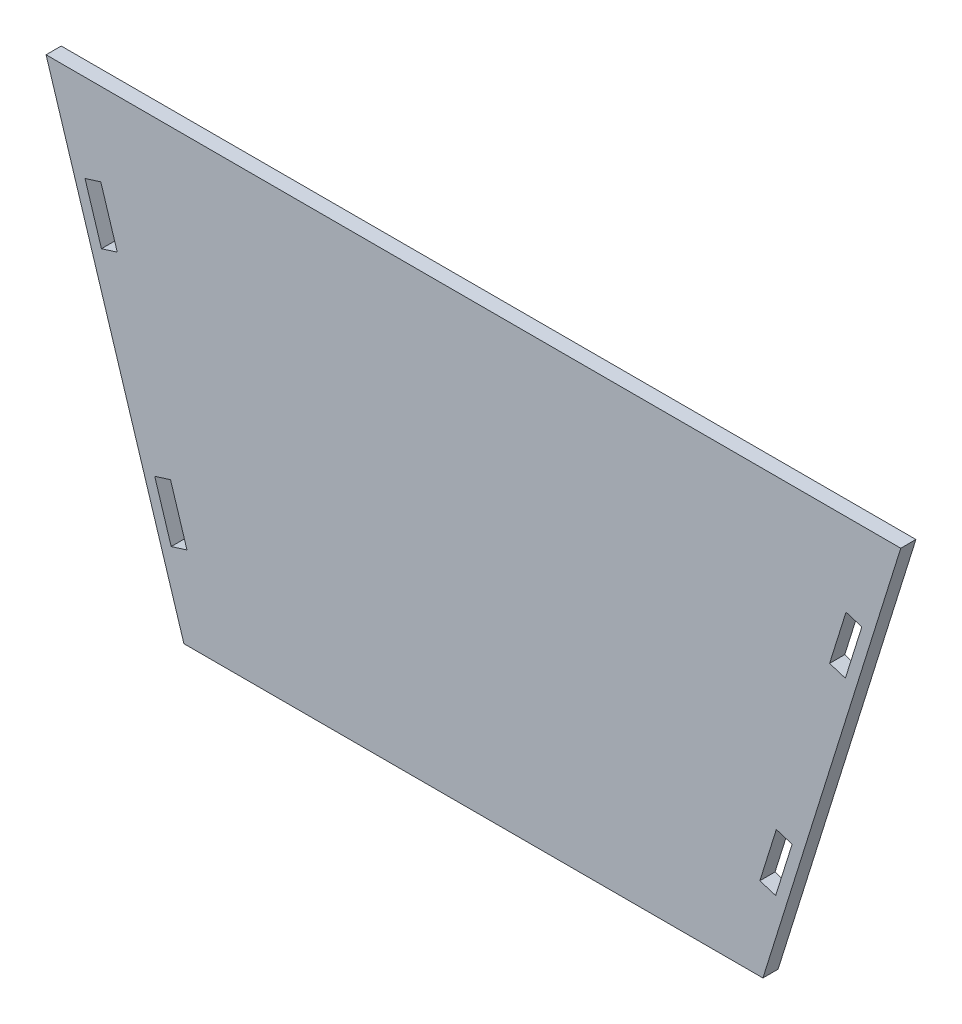
ISO-10303-21;
HEADER;
FILE_DESCRIPTION(('STEP AP214'),'2;1');
FILE_NAME('part.step','',(''),(''),'','','');
FILE_SCHEMA(('AUTOMOTIVE_DESIGN { 1 0 10303 214 1 1 1 1 }'));
ENDSEC;
DATA;
#1=APPLICATION_CONTEXT('core data for automotive mechanical design processes');
#2=APPLICATION_PROTOCOL_DEFINITION('international standard','automotive_design',2000,#1);
#3=PRODUCT_CONTEXT('',#1,'mechanical');
#4=PRODUCT('Part','Part','',(#3));
#5=PRODUCT_RELATED_PRODUCT_CATEGORY('part','',(#4));
#6=PRODUCT_DEFINITION_FORMATION('','',#4);
#7=PRODUCT_DEFINITION_CONTEXT('part definition',#1,'design');
#8=PRODUCT_DEFINITION('design','',#6,#7);
#9=PRODUCT_DEFINITION_SHAPE('','',#8);
#10=(LENGTH_UNIT() NAMED_UNIT(*) SI_UNIT(.MILLI.,.METRE.));
#11=(NAMED_UNIT(*) PLANE_ANGLE_UNIT() SI_UNIT($,.RADIAN.));
#12=(NAMED_UNIT(*) SI_UNIT($,.STERADIAN.) SOLID_ANGLE_UNIT());
#13=UNCERTAINTY_MEASURE_WITH_UNIT(LENGTH_MEASURE(1.E-05),#10,'distance_accuracy_value','');
#14=(GEOMETRIC_REPRESENTATION_CONTEXT(3) GLOBAL_UNCERTAINTY_ASSIGNED_CONTEXT((#13)) GLOBAL_UNIT_ASSIGNED_CONTEXT((#10,
#11,#12)) REPRESENTATION_CONTEXT('',''));
#15=CARTESIAN_POINT('',(0.,0.,0.));
#16=DIRECTION('',(0.,0.,1.));
#17=DIRECTION('',(1.,0.,0.));
#18=AXIS2_PLACEMENT_3D('',#15,#16,#17);
#19=CARTESIAN_POINT('',(52.5,0.,2.75));
#20=DIRECTION('',(-0.95447997803503,0.298274993135947,0.));
#21=DIRECTION('',(-0.298274993135947,-0.95447997803503,0.));
#22=AXIS2_PLACEMENT_3D('',#19,#20,#21);
#23=PLANE('',#22);
#24=DIRECTION('',(0.298274993135947,0.95447997803503,0.));
#25=VECTOR('',#24,1.);
#26=CARTESIAN_POINT('',(52.5,0.,0.));
#27=LINE('',#26,#25);
#28=CARTESIAN_POINT('',(52.5,0.,0.));
#29=VERTEX_POINT('',#28);
#30=CARTESIAN_POINT('',(77.5,80.,0.));
#31=VERTEX_POINT('',#30);
#32=EDGE_CURVE('E212',#29,#31,#27,.T.);
#33=ORIENTED_EDGE('',*,*,#32,.T.);
#34=DIRECTION('',(0.,0.,-1.));
#35=VECTOR('',#34,1.);
#36=CARTESIAN_POINT('',(77.5,80.,2.75));
#37=LINE('',#36,#35);
#38=CARTESIAN_POINT('',(77.5,80.,2.75));
#39=VERTEX_POINT('',#38);
#40=EDGE_CURVE('E336',#39,#31,#37,.T.);
#41=ORIENTED_EDGE('',*,*,#40,.F.);
#42=DIRECTION('',(0.298274993135947,0.95447997803503,0.));
#43=VECTOR('',#42,1.);
#44=CARTESIAN_POINT('',(52.5,0.,2.75));
#45=LINE('',#44,#43);
#46=CARTESIAN_POINT('',(52.5,0.,2.75));
#47=VERTEX_POINT('',#46);
#48=EDGE_CURVE('E299',#47,#39,#45,.T.);
#49=ORIENTED_EDGE('',*,*,#48,.F.);
#50=DIRECTION('',(0.,0.,-1.));
#51=VECTOR('',#50,1.);
#52=CARTESIAN_POINT('',(52.5,0.,2.75));
#53=LINE('',#52,#51);
#54=EDGE_CURVE('E313',#47,#29,#53,.T.);
#55=ORIENTED_EDGE('',*,*,#54,.T.);
#56=EDGE_LOOP('',(#33,#41,#49,#55));
#57=FACE_BOUND('',#56,.T.);
#58=ADVANCED_FACE('F39',(#57),#23,.F.);
#59=CARTESIAN_POINT('',(77.5,80.,2.75));
#60=DIRECTION('',(0.,-1.,0.));
#61=DIRECTION('',(0.,0.,-1.));
#62=AXIS2_PLACEMENT_3D('',#59,#60,#61);
#63=PLANE('',#62);
#64=DIRECTION('',(-1.,0.,0.));
#65=VECTOR('',#64,1.);
#66=CARTESIAN_POINT('',(77.5,80.,0.));
#67=LINE('',#66,#65);
#68=CARTESIAN_POINT('',(-77.5,80.,0.));
#69=VERTEX_POINT('',#68);
#70=EDGE_CURVE('E317',#31,#69,#67,.T.);
#71=ORIENTED_EDGE('',*,*,#70,.T.);
#72=DIRECTION('',(0.,0.,-1.));
#73=VECTOR('',#72,1.);
#74=CARTESIAN_POINT('',(-77.5,80.,2.75));
#75=LINE('',#74,#73);
#76=CARTESIAN_POINT('',(-77.5,80.,2.75));
#77=VERTEX_POINT('',#76);
#78=EDGE_CURVE('E332',#77,#69,#75,.T.);
#79=ORIENTED_EDGE('',*,*,#78,.F.);
#80=DIRECTION('',(-1.,0.,0.));
#81=VECTOR('',#80,1.);
#82=CARTESIAN_POINT('',(77.5,80.,2.75));
#83=LINE('',#82,#81);
#84=EDGE_CURVE('E303',#39,#77,#83,.T.);
#85=ORIENTED_EDGE('',*,*,#84,.F.);
#86=ORIENTED_EDGE('',*,*,#40,.T.);
#87=EDGE_LOOP('',(#71,#79,#85,#86));
#88=FACE_BOUND('',#87,.T.);
#89=ADVANCED_FACE('F415',(#88),#63,.F.);
#90=CARTESIAN_POINT('',(-52.5,0.,2.75));
#91=DIRECTION('',(0.95447997803503,0.298274993135947,0.));
#92=DIRECTION('',(-0.298274993135947,0.95447997803503,0.));
#93=AXIS2_PLACEMENT_3D('',#90,#91,#92);
#94=PLANE('',#93);
#95=DIRECTION('',(0.298274993135947,-0.95447997803503,0.));
#96=VECTOR('',#95,1.);
#97=CARTESIAN_POINT('',(-52.5,0.,0.));
#98=LINE('',#97,#96);
#99=CARTESIAN_POINT('',(-52.5,0.,0.));
#100=VERTEX_POINT('',#99);
#101=EDGE_CURVE('E320',#69,#100,#98,.T.);
#102=ORIENTED_EDGE('',*,*,#101,.T.);
#103=DIRECTION('',(0.,0.,-1.));
#104=VECTOR('',#103,1.);
#105=CARTESIAN_POINT('',(-52.5,0.,2.75));
#106=LINE('',#105,#104);
#107=CARTESIAN_POINT('',(-52.5,0.,2.75));
#108=VERTEX_POINT('',#107);
#109=EDGE_CURVE('E328',#108,#100,#106,.T.);
#110=ORIENTED_EDGE('',*,*,#109,.F.);
#111=DIRECTION('',(0.298274993135947,-0.95447997803503,0.));
#112=VECTOR('',#111,1.);
#113=CARTESIAN_POINT('',(-52.5,0.,2.75));
#114=LINE('',#113,#112);
#115=EDGE_CURVE('E307',#77,#108,#114,.T.);
#116=ORIENTED_EDGE('',*,*,#115,.F.);
#117=ORIENTED_EDGE('',*,*,#78,.T.);
#118=EDGE_LOOP('',(#102,#110,#116,#117));
#119=FACE_BOUND('',#118,.T.);
#120=ADVANCED_FACE('F420',(#119),#94,.F.);
#121=CARTESIAN_POINT('',(-52.5,0.,2.75));
#122=DIRECTION('',(0.,1.,0.));
#123=DIRECTION('',(0.,0.,1.));
#124=AXIS2_PLACEMENT_3D('',#121,#122,#123);
#125=PLANE('',#124);
#126=DIRECTION('',(1.,0.,0.));
#127=VECTOR('',#126,1.);
#128=CARTESIAN_POINT('',(-52.5,0.,0.));
#129=LINE('',#128,#127);
#130=EDGE_CURVE('E304',#100,#29,#129,.T.);
#131=ORIENTED_EDGE('',*,*,#130,.T.);
#132=ORIENTED_EDGE('',*,*,#54,.F.);
#133=DIRECTION('',(1.,0.,0.));
#134=VECTOR('',#133,1.);
#135=CARTESIAN_POINT('',(-52.5,0.,2.75));
#136=LINE('',#135,#134);
#137=EDGE_CURVE('E310',#108,#47,#136,.T.);
#138=ORIENTED_EDGE('',*,*,#137,.F.);
#139=ORIENTED_EDGE('',*,*,#109,.T.);
#140=EDGE_LOOP('',(#131,#132,#138,#139));
#141=FACE_BOUND('',#140,.T.);
#142=ADVANCED_FACE('F435',(#141),#125,.F.);
#143=CARTESIAN_POINT('',(0.,0.,2.75));
#144=DIRECTION('',(0.,0.,1.));
#145=DIRECTION('',(1.,0.,0.));
#146=AXIS2_PLACEMENT_3D('',#143,#144,#145);
#147=PLANE('',#146);
#148=DIRECTION('',(-0.95447997803503,0.298274993135945,0.));
#149=VECTOR('',#148,1.);
#150=CARTESIAN_POINT('',(70.437485367155,64.1051750205922,2.75));
#151=LINE('',#150,#149);
#152=CARTESIAN_POINT('',(70.437485367155,64.1051750205922,2.75));
#153=VERTEX_POINT('',#152);
#154=CARTESIAN_POINT('',(67.5740454330499,65.,2.75));
#155=VERTEX_POINT('',#154);
#156=EDGE_CURVE('E54',#153,#155,#151,.T.);
#157=ORIENTED_EDGE('',*,*,#156,.F.);
#158=DIRECTION('',(0.298274993135946,0.95447997803503,0.));
#159=VECTOR('',#158,1.);
#160=CARTESIAN_POINT('',(70.437485367155,64.1051750205922,2.75));
#161=LINE('',#160,#159);
#162=CARTESIAN_POINT('',(67.4547354357955,54.5603752402418,2.75));
#163=VERTEX_POINT('',#162);
#164=EDGE_CURVE('E202',#163,#153,#161,.T.);
#165=ORIENTED_EDGE('',*,*,#164,.F.);
#166=DIRECTION('',(0.954479978035028,-0.298274993135952,0.));
#167=VECTOR('',#166,1.);
#168=CARTESIAN_POINT('',(67.4547354357955,54.5603752402418,2.75));
#169=LINE('',#168,#167);
#170=CARTESIAN_POINT('',(64.5912955016905,55.4552002196497,2.75));
#171=VERTEX_POINT('',#170);
#172=EDGE_CURVE('E183',#171,#163,#169,.T.);
#173=ORIENTED_EDGE('',*,*,#172,.F.);
#174=DIRECTION('',(-0.298274993135944,-0.954479978035031,0.));
#175=VECTOR('',#174,1.);
#176=CARTESIAN_POINT('',(67.5740454330499,65.,2.75));
#177=LINE('',#176,#175);
#178=EDGE_CURVE('E194',#155,#171,#177,.T.);
#179=ORIENTED_EDGE('',*,*,#178,.F.);
#180=EDGE_LOOP('',(#157,#165,#173,#179));
#181=FACE_BOUND('',#180,.T.);
#182=DIRECTION('',(-0.954479978035029,0.298274993135949,0.));
#183=VECTOR('',#182,1.);
#184=CARTESIAN_POINT('',(57.7952352985145,23.6499748009425,2.75));
#185=LINE('',#184,#183);
#186=CARTESIAN_POINT('',(57.7952352985145,23.6499748009425,2.75));
#187=VERTEX_POINT('',#186);
#188=CARTESIAN_POINT('',(54.9317953644094,24.5447997803503,2.75));
#189=VERTEX_POINT('',#188);
#190=EDGE_CURVE('E62',#187,#189,#185,.T.);
#191=ORIENTED_EDGE('',*,*,#190,.F.);
#192=DIRECTION('',(0.298274993135947,0.95447997803503,0.));
#193=VECTOR('',#192,1.);
#194=CARTESIAN_POINT('',(57.7952352985145,23.6499748009425,2.75));
#195=LINE('',#194,#193);
#196=CARTESIAN_POINT('',(54.812485367155,14.1051750205922,2.75));
#197=VERTEX_POINT('',#196);
#198=EDGE_CURVE('E228',#197,#187,#195,.T.);
#199=ORIENTED_EDGE('',*,*,#198,.F.);
#200=DIRECTION('',(0.954479978035029,-0.298274993135947,0.));
#201=VECTOR('',#200,1.);
#202=CARTESIAN_POINT('',(54.812485367155,14.1051750205922,2.75));
#203=LINE('',#202,#201);
#204=CARTESIAN_POINT('',(51.9490454330499,15.,2.75));
#205=VERTEX_POINT('',#204);
#206=EDGE_CURVE('E224',#205,#197,#203,.T.);
#207=ORIENTED_EDGE('',*,*,#206,.F.);
#208=DIRECTION('',(-0.298274993135948,-0.954479978035029,0.));
#209=VECTOR('',#208,1.);
#210=CARTESIAN_POINT('',(54.9317953644094,24.5447997803503,2.75));
#211=LINE('',#210,#209);
#212=EDGE_CURVE('E219',#189,#205,#211,.T.);
#213=ORIENTED_EDGE('',*,*,#212,.F.);
#214=EDGE_LOOP('',(#191,#199,#207,#213));
#215=FACE_BOUND('',#214,.T.);
#216=DIRECTION('',(-0.954479978035029,-0.298274993135949,0.));
#217=VECTOR('',#216,1.);
#218=CARTESIAN_POINT('',(-57.7952352985145,23.6499748009425,2.75));
#219=LINE('',#218,#217);
#220=CARTESIAN_POINT('',(-54.9317953644094,24.5447997803503,2.75));
#221=VERTEX_POINT('',#220);
#222=CARTESIAN_POINT('',(-57.7952352985145,23.6499748009425,2.75));
#223=VERTEX_POINT('',#222);
#224=EDGE_CURVE('E244',#221,#223,#219,.T.);
#225=ORIENTED_EDGE('',*,*,#224,.F.);
#226=DIRECTION('',(-0.298274993135948,0.954479978035029,0.));
#227=VECTOR('',#226,1.);
#228=CARTESIAN_POINT('',(-54.9317953644094,24.5447997803503,2.75));
#229=LINE('',#228,#227);
#230=CARTESIAN_POINT('',(-51.9490454330499,15.,2.75));
#231=VERTEX_POINT('',#230);
#232=EDGE_CURVE('E256',#231,#221,#229,.T.);
#233=ORIENTED_EDGE('',*,*,#232,.F.);
#234=DIRECTION('',(0.954479978035029,0.298274993135947,0.));
#235=VECTOR('',#234,1.);
#236=CARTESIAN_POINT('',(-54.812485367155,14.1051750205922,2.75));
#237=LINE('',#236,#235);
#238=CARTESIAN_POINT('',(-54.812485367155,14.1051750205922,2.75));
#239=VERTEX_POINT('',#238);
#240=EDGE_CURVE('E252',#239,#231,#237,.T.);
#241=ORIENTED_EDGE('',*,*,#240,.F.);
#242=DIRECTION('',(0.298274993135947,-0.95447997803503,0.));
#243=VECTOR('',#242,1.);
#244=CARTESIAN_POINT('',(-57.7952352985145,23.6499748009425,2.75));
#245=LINE('',#244,#243);
#246=EDGE_CURVE('E247',#223,#239,#245,.T.);
#247=ORIENTED_EDGE('',*,*,#246,.F.);
#248=EDGE_LOOP('',(#225,#233,#241,#247));
#249=FACE_BOUND('',#248,.T.);
#250=DIRECTION('',(-0.95447997803503,-0.298274993135945,0.));
#251=VECTOR('',#250,1.);
#252=CARTESIAN_POINT('',(-70.437485367155,64.1051750205922,2.75));
#253=LINE('',#252,#251);
#254=CARTESIAN_POINT('',(-67.5740454330499,65.,2.75));
#255=VERTEX_POINT('',#254);
#256=CARTESIAN_POINT('',(-70.437485367155,64.1051750205922,2.75));
#257=VERTEX_POINT('',#256);
#258=EDGE_CURVE('E272',#255,#257,#253,.T.);
#259=ORIENTED_EDGE('',*,*,#258,.F.);
#260=DIRECTION('',(-0.298274993135946,0.95447997803503,0.));
#261=VECTOR('',#260,1.);
#262=CARTESIAN_POINT('',(-67.5740454330499,65.,2.75));
#263=LINE('',#262,#261);
#264=CARTESIAN_POINT('',(-64.5912955016904,55.4552002196497,2.75));
#265=VERTEX_POINT('',#264);
#266=EDGE_CURVE('E283',#265,#255,#263,.T.);
#267=ORIENTED_EDGE('',*,*,#266,.F.);
#268=DIRECTION('',(0.954479978035027,0.298274993135957,0.));
#269=VECTOR('',#268,1.);
#270=CARTESIAN_POINT('',(-67.4547354357955,54.5603752402418,2.75));
#271=LINE('',#270,#269);
#272=CARTESIAN_POINT('',(-67.4547354357955,54.5603752402418,2.75));
#273=VERTEX_POINT('',#272);
#274=EDGE_CURVE('E279',#273,#265,#271,.T.);
#275=ORIENTED_EDGE('',*,*,#274,.F.);
#276=DIRECTION('',(0.298274993135946,-0.95447997803503,0.));
#277=VECTOR('',#276,1.);
#278=CARTESIAN_POINT('',(-70.437485367155,64.1051750205922,2.75));
#279=LINE('',#278,#277);
#280=EDGE_CURVE('E275',#257,#273,#279,.T.);
#281=ORIENTED_EDGE('',*,*,#280,.F.);
#282=EDGE_LOOP('',(#259,#267,#275,#281));
#283=FACE_BOUND('',#282,.T.);
#284=ORIENTED_EDGE('',*,*,#48,.T.);
#285=ORIENTED_EDGE('',*,*,#84,.T.);
#286=ORIENTED_EDGE('',*,*,#115,.T.);
#287=ORIENTED_EDGE('',*,*,#137,.T.);
#288=EDGE_LOOP('',(#284,#285,#286,#287));
#289=FACE_BOUND('',#288,.T.);
#290=ADVANCED_FACE('F199',(#181,#215,#249,#283,#289),#147,.T.);
#291=CARTESIAN_POINT('',(0.,0.,0.));
#292=DIRECTION('',(0.,0.,1.));
#293=DIRECTION('',(1.,0.,0.));
#294=AXIS2_PLACEMENT_3D('',#291,#292,#293);
#295=PLANE('',#294);
#296=DIRECTION('',(0.298274993135946,0.95447997803503,0.));
#297=VECTOR('',#296,1.);
#298=CARTESIAN_POINT('',(45.9202215385919,-14.3500692308099,0.));
#299=LINE('',#298,#297);
#300=CARTESIAN_POINT('',(67.4547354357955,54.5603752402418,0.));
#301=VERTEX_POINT('',#300);
#302=CARTESIAN_POINT('',(70.437485367155,64.1051750205922,0.));
#303=VERTEX_POINT('',#302);
#304=EDGE_CURVE('E47',#301,#303,#299,.T.);
#305=ORIENTED_EDGE('',*,*,#304,.T.);
#306=DIRECTION('',(-0.95447997803503,0.298274993135945,0.));
#307=VECTOR('',#306,1.);
#308=CARTESIAN_POINT('',(24.517263828563,78.4552442514021,0.));
#309=LINE('',#308,#307);
#310=CARTESIAN_POINT('',(67.5740454330499,65.,0.));
#311=VERTEX_POINT('',#310);
#312=EDGE_CURVE('E11',#303,#311,#309,.T.);
#313=ORIENTED_EDGE('',*,*,#312,.T.);
#314=DIRECTION('',(-0.298274993135944,-0.954479978035031,0.));
#315=VECTOR('',#314,1.);
#316=CARTESIAN_POINT('',(43.056781604487,-13.455244251402,0.));
#317=LINE('',#316,#315);
#318=CARTESIAN_POINT('',(64.5912955016905,55.4552002196497,0.));
#319=VERTEX_POINT('',#318);
#320=EDGE_CURVE('E388',#311,#319,#317,.T.);
#321=ORIENTED_EDGE('',*,*,#320,.T.);
#322=DIRECTION('',(0.954479978035028,-0.298274993135952,0.));
#323=VECTOR('',#322,1.);
#324=CARTESIAN_POINT('',(21.5345138972041,68.9104444710519,0.));
#325=LINE('',#324,#323);
#326=EDGE_CURVE('E186',#319,#301,#325,.T.);
#327=ORIENTED_EDGE('',*,*,#326,.T.);
#328=EDGE_LOOP('',(#305,#313,#321,#327));
#329=FACE_BOUND('',#328,.T.);
#330=DIRECTION('',(0.298274993135947,0.95447997803503,0.));
#331=VECTOR('',#330,1.);
#332=CARTESIAN_POINT('',(45.9202215385919,-14.35006923081,0.));
#333=LINE('',#332,#331);
#334=CARTESIAN_POINT('',(54.812485367155,14.1051750205922,0.));
#335=VERTEX_POINT('',#334);
#336=CARTESIAN_POINT('',(57.7952352985145,23.6499748009425,0.));
#337=VERTEX_POINT('',#336);
#338=EDGE_CURVE('E380',#335,#337,#333,.T.);
#339=ORIENTED_EDGE('',*,*,#338,.T.);
#340=DIRECTION('',(-0.954479978035029,0.298274993135949,0.));
#341=VECTOR('',#340,1.);
#342=CARTESIAN_POINT('',(11.8750137599227,38.0000440317525,0.));
#343=LINE('',#342,#341);
#344=CARTESIAN_POINT('',(54.9317953644094,24.5447997803503,0.));
#345=VERTEX_POINT('',#344);
#346=EDGE_CURVE('E384',#337,#345,#343,.T.);
#347=ORIENTED_EDGE('',*,*,#346,.T.);
#348=DIRECTION('',(-0.298274993135948,-0.954479978035029,0.));
#349=VECTOR('',#348,1.);
#350=CARTESIAN_POINT('',(43.0567816044867,-13.4552442514022,0.));
#351=LINE('',#350,#349);
#352=CARTESIAN_POINT('',(51.9490454330499,15.,0.));
#353=VERTEX_POINT('',#352);
#354=EDGE_CURVE('E372',#345,#353,#351,.T.);
#355=ORIENTED_EDGE('',*,*,#354,.T.);
#356=DIRECTION('',(0.95447997803503,-0.298274993135948,0.));
#357=VECTOR('',#356,1.);
#358=CARTESIAN_POINT('',(8.89226382856319,28.4552442514021,0.));
#359=LINE('',#358,#357);
#360=EDGE_CURVE('E376',#353,#335,#359,.T.);
#361=ORIENTED_EDGE('',*,*,#360,.T.);
#362=EDGE_LOOP('',(#339,#347,#355,#361));
#363=FACE_BOUND('',#362,.T.);
#364=DIRECTION('',(-0.298274993135948,0.954479978035029,0.));
#365=VECTOR('',#364,1.);
#366=CARTESIAN_POINT('',(-43.0567816044867,-13.4552442514022,0.));
#367=LINE('',#366,#365);
#368=CARTESIAN_POINT('',(-51.9490454330499,15.,0.));
#369=VERTEX_POINT('',#368);
#370=CARTESIAN_POINT('',(-54.9317953644094,24.5447997803503,0.));
#371=VERTEX_POINT('',#370);
#372=EDGE_CURVE('E364',#369,#371,#367,.T.);
#373=ORIENTED_EDGE('',*,*,#372,.T.);
#374=DIRECTION('',(-0.954479978035029,-0.298274993135949,0.));
#375=VECTOR('',#374,1.);
#376=CARTESIAN_POINT('',(-11.8750137599227,38.0000440317525,0.));
#377=LINE('',#376,#375);
#378=CARTESIAN_POINT('',(-57.7952352985145,23.6499748009425,0.));
#379=VERTEX_POINT('',#378);
#380=EDGE_CURVE('E368',#371,#379,#377,.T.);
#381=ORIENTED_EDGE('',*,*,#380,.T.);
#382=DIRECTION('',(0.298274993135947,-0.95447997803503,0.));
#383=VECTOR('',#382,1.);
#384=CARTESIAN_POINT('',(-45.9202215385919,-14.35006923081,0.));
#385=LINE('',#384,#383);
#386=CARTESIAN_POINT('',(-54.812485367155,14.1051750205922,0.));
#387=VERTEX_POINT('',#386);
#388=EDGE_CURVE('E356',#379,#387,#385,.T.);
#389=ORIENTED_EDGE('',*,*,#388,.T.);
#390=DIRECTION('',(0.95447997803503,0.298274993135948,0.));
#391=VECTOR('',#390,1.);
#392=CARTESIAN_POINT('',(-8.89226382856319,28.4552442514021,0.));
#393=LINE('',#392,#391);
#394=EDGE_CURVE('E360',#387,#369,#393,.T.);
#395=ORIENTED_EDGE('',*,*,#394,.T.);
#396=EDGE_LOOP('',(#373,#381,#389,#395));
#397=FACE_BOUND('',#396,.T.);
#398=DIRECTION('',(-0.298274993135946,0.95447997803503,0.));
#399=VECTOR('',#398,1.);
#400=CARTESIAN_POINT('',(-43.0567816044869,-13.4552442514021,0.));
#401=LINE('',#400,#399);
#402=CARTESIAN_POINT('',(-64.5912955016904,55.4552002196497,0.));
#403=VERTEX_POINT('',#402);
#404=CARTESIAN_POINT('',(-67.5740454330499,65.,0.));
#405=VERTEX_POINT('',#404);
#406=EDGE_CURVE('E348',#403,#405,#401,.T.);
#407=ORIENTED_EDGE('',*,*,#406,.T.);
#408=DIRECTION('',(-0.95447997803503,-0.298274993135945,0.));
#409=VECTOR('',#408,1.);
#410=CARTESIAN_POINT('',(-24.517263828563,78.4552442514021,0.));
#411=LINE('',#410,#409);
#412=CARTESIAN_POINT('',(-70.437485367155,64.1051750205922,0.));
#413=VERTEX_POINT('',#412);
#414=EDGE_CURVE('E352',#405,#413,#411,.T.);
#415=ORIENTED_EDGE('',*,*,#414,.T.);
#416=DIRECTION('',(0.298274993135946,-0.95447997803503,0.));
#417=VECTOR('',#416,1.);
#418=CARTESIAN_POINT('',(-45.9202215385919,-14.3500692308099,0.));
#419=LINE('',#418,#417);
#420=CARTESIAN_POINT('',(-67.4547354357955,54.5603752402418,0.));
#421=VERTEX_POINT('',#420);
#422=EDGE_CURVE('E340',#413,#421,#419,.T.);
#423=ORIENTED_EDGE('',*,*,#422,.T.);
#424=DIRECTION('',(0.954479978035027,0.298274993135957,0.));
#425=VECTOR('',#424,1.);
#426=CARTESIAN_POINT('',(-21.5345138972045,68.910444471052,0.));
#427=LINE('',#426,#425);
#428=EDGE_CURVE('E344',#421,#403,#427,.T.);
#429=ORIENTED_EDGE('',*,*,#428,.T.);
#430=EDGE_LOOP('',(#407,#415,#423,#429));
#431=FACE_BOUND('',#430,.T.);
#432=ORIENTED_EDGE('',*,*,#32,.F.);
#433=ORIENTED_EDGE('',*,*,#130,.F.);
#434=ORIENTED_EDGE('',*,*,#101,.F.);
#435=ORIENTED_EDGE('',*,*,#70,.F.);
#436=EDGE_LOOP('',(#432,#433,#434,#435));
#437=FACE_BOUND('',#436,.T.);
#438=ADVANCED_FACE('F395',(#329,#363,#397,#431,#437),#295,.F.);
#439=CARTESIAN_POINT('',(-70.437485367155,64.1051750205922,-7.25));
#440=DIRECTION('',(-0.298274993135945,0.95447997803503,0.));
#441=DIRECTION('',(-0.95447997803503,-0.298274993135945,0.));
#442=AXIS2_PLACEMENT_3D('',#439,#440,#441);
#443=PLANE('',#442);
#444=DIRECTION('',(0.,0.,1.));
#445=VECTOR('',#444,1.);
#446=CARTESIAN_POINT('',(-67.5740454330499,65.,-7.25));
#447=LINE('',#446,#445);
#448=EDGE_CURVE('E248',#405,#255,#447,.T.);
#449=ORIENTED_EDGE('',*,*,#448,.T.);
#450=ORIENTED_EDGE('',*,*,#258,.T.);
#451=DIRECTION('',(0.,0.,1.));
#452=VECTOR('',#451,1.);
#453=CARTESIAN_POINT('',(-70.437485367155,64.1051750205922,-7.25));
#454=LINE('',#453,#452);
#455=EDGE_CURVE('E287',#413,#257,#454,.T.);
#456=ORIENTED_EDGE('',*,*,#455,.F.);
#457=ORIENTED_EDGE('',*,*,#414,.F.);
#458=EDGE_LOOP('',(#449,#450,#456,#457));
#459=FACE_BOUND('',#458,.T.);
#460=ADVANCED_FACE('F446',(#459),#443,.F.);
#461=CARTESIAN_POINT('',(-67.5740454330499,65.,-7.25));
#462=DIRECTION('',(0.95447997803503,0.298274993135946,0.));
#463=DIRECTION('',(-0.298274993135946,0.95447997803503,0.));
#464=AXIS2_PLACEMENT_3D('',#461,#462,#463);
#465=PLANE('',#464);
#466=DIRECTION('',(0.,0.,1.));
#467=VECTOR('',#466,1.);
#468=CARTESIAN_POINT('',(-64.5912955016904,55.4552002196497,-7.25));
#469=LINE('',#468,#467);
#470=EDGE_CURVE('E290',#403,#265,#469,.T.);
#471=ORIENTED_EDGE('',*,*,#470,.T.);
#472=ORIENTED_EDGE('',*,*,#266,.T.);
#473=ORIENTED_EDGE('',*,*,#448,.F.);
#474=ORIENTED_EDGE('',*,*,#406,.F.);
#475=EDGE_LOOP('',(#471,#472,#473,#474));
#476=FACE_BOUND('',#475,.T.);
#477=ADVANCED_FACE('F451',(#476),#465,.F.);
#478=CARTESIAN_POINT('',(-67.4547354357955,54.5603752402418,-7.25));
#479=DIRECTION('',(0.298274993135957,-0.954479978035027,0.));
#480=DIRECTION('',(0.954479978035027,0.298274993135957,0.));
#481=AXIS2_PLACEMENT_3D('',#478,#479,#480);
#482=PLANE('',#481);
#483=DIRECTION('',(0.,0.,1.));
#484=VECTOR('',#483,1.);
#485=CARTESIAN_POINT('',(-67.4547354357955,54.5603752402418,-7.25));
#486=LINE('',#485,#484);
#487=EDGE_CURVE('E293',#421,#273,#486,.T.);
#488=ORIENTED_EDGE('',*,*,#487,.T.);
#489=ORIENTED_EDGE('',*,*,#274,.T.);
#490=ORIENTED_EDGE('',*,*,#470,.F.);
#491=ORIENTED_EDGE('',*,*,#428,.F.);
#492=EDGE_LOOP('',(#488,#489,#490,#491));
#493=FACE_BOUND('',#492,.T.);
#494=ADVANCED_FACE('F457',(#493),#482,.F.);
#495=CARTESIAN_POINT('',(-70.437485367155,64.1051750205922,-7.25));
#496=DIRECTION('',(-0.95447997803503,-0.298274993135946,0.));
#497=DIRECTION('',(0.298274993135946,-0.95447997803503,0.));
#498=AXIS2_PLACEMENT_3D('',#495,#496,#497);
#499=PLANE('',#498);
#500=ORIENTED_EDGE('',*,*,#455,.T.);
#501=ORIENTED_EDGE('',*,*,#280,.T.);
#502=ORIENTED_EDGE('',*,*,#487,.F.);
#503=ORIENTED_EDGE('',*,*,#422,.F.);
#504=EDGE_LOOP('',(#500,#501,#502,#503));
#505=FACE_BOUND('',#504,.T.);
#506=ADVANCED_FACE('F453',(#505),#499,.F.);
#507=CARTESIAN_POINT('',(-57.7952352985145,23.6499748009425,-7.25));
#508=DIRECTION('',(-0.298274993135949,0.954479978035029,0.));
#509=DIRECTION('',(-0.954479978035029,-0.298274993135949,0.));
#510=AXIS2_PLACEMENT_3D('',#507,#508,#509);
#511=PLANE('',#510);
#512=DIRECTION('',(0.,0.,1.));
#513=VECTOR('',#512,1.);
#514=CARTESIAN_POINT('',(-54.9317953644094,24.5447997803503,-7.25));
#515=LINE('',#514,#513);
#516=EDGE_CURVE('E220',#371,#221,#515,.T.);
#517=ORIENTED_EDGE('',*,*,#516,.T.);
#518=ORIENTED_EDGE('',*,*,#224,.T.);
#519=DIRECTION('',(0.,0.,1.));
#520=VECTOR('',#519,1.);
#521=CARTESIAN_POINT('',(-57.7952352985145,23.6499748009425,-7.25));
#522=LINE('',#521,#520);
#523=EDGE_CURVE('E260',#379,#223,#522,.T.);
#524=ORIENTED_EDGE('',*,*,#523,.F.);
#525=ORIENTED_EDGE('',*,*,#380,.F.);
#526=EDGE_LOOP('',(#517,#518,#524,#525));
#527=FACE_BOUND('',#526,.T.);
#528=ADVANCED_FACE('F456',(#527),#511,.F.);
#529=CARTESIAN_POINT('',(-54.9317953644094,24.5447997803503,-7.25));
#530=DIRECTION('',(0.954479978035029,0.298274993135948,0.));
#531=DIRECTION('',(-0.298274993135948,0.954479978035029,0.));
#532=AXIS2_PLACEMENT_3D('',#529,#530,#531);
#533=PLANE('',#532);
#534=DIRECTION('',(0.,0.,1.));
#535=VECTOR('',#534,1.);
#536=CARTESIAN_POINT('',(-51.9490454330499,15.,-7.25));
#537=LINE('',#536,#535);
#538=EDGE_CURVE('E263',#369,#231,#537,.T.);
#539=ORIENTED_EDGE('',*,*,#538,.T.);
#540=ORIENTED_EDGE('',*,*,#232,.T.);
#541=ORIENTED_EDGE('',*,*,#516,.F.);
#542=ORIENTED_EDGE('',*,*,#372,.F.);
#543=EDGE_LOOP('',(#539,#540,#541,#542));
#544=FACE_BOUND('',#543,.T.);
#545=ADVANCED_FACE('F467',(#544),#533,.F.);
#546=CARTESIAN_POINT('',(-54.812485367155,14.1051750205922,-7.25));
#547=DIRECTION('',(0.298274993135948,-0.95447997803503,0.));
#548=DIRECTION('',(0.95447997803503,0.298274993135948,0.));
#549=AXIS2_PLACEMENT_3D('',#546,#547,#548);
#550=PLANE('',#549);
#551=DIRECTION('',(0.,0.,1.));
#552=VECTOR('',#551,1.);
#553=CARTESIAN_POINT('',(-54.812485367155,14.1051750205922,-7.25));
#554=LINE('',#553,#552);
#555=EDGE_CURVE('E266',#387,#239,#554,.T.);
#556=ORIENTED_EDGE('',*,*,#555,.T.);
#557=ORIENTED_EDGE('',*,*,#240,.T.);
#558=ORIENTED_EDGE('',*,*,#538,.F.);
#559=ORIENTED_EDGE('',*,*,#394,.F.);
#560=EDGE_LOOP('',(#556,#557,#558,#559));
#561=FACE_BOUND('',#560,.T.);
#562=ADVANCED_FACE('F473',(#561),#550,.F.);
#563=CARTESIAN_POINT('',(-57.7952352985145,23.6499748009425,-7.25));
#564=DIRECTION('',(-0.95447997803503,-0.298274993135947,0.));
#565=DIRECTION('',(0.298274993135947,-0.95447997803503,0.));
#566=AXIS2_PLACEMENT_3D('',#563,#564,#565);
#567=PLANE('',#566);
#568=ORIENTED_EDGE('',*,*,#523,.T.);
#569=ORIENTED_EDGE('',*,*,#246,.T.);
#570=ORIENTED_EDGE('',*,*,#555,.F.);
#571=ORIENTED_EDGE('',*,*,#388,.F.);
#572=EDGE_LOOP('',(#568,#569,#570,#571));
#573=FACE_BOUND('',#572,.T.);
#574=ADVANCED_FACE('F469',(#573),#567,.F.);
#575=CARTESIAN_POINT('',(57.7952352985145,23.6499748009425,-7.25));
#576=DIRECTION('',(0.298274993135949,0.954479978035029,0.));
#577=DIRECTION('',(-0.954479978035029,0.298274993135949,0.));
#578=AXIS2_PLACEMENT_3D('',#575,#576,#577);
#579=PLANE('',#578);
#580=DIRECTION('',(0.,0.,1.));
#581=VECTOR('',#580,1.);
#582=CARTESIAN_POINT('',(57.7952352985145,23.6499748009425,-7.25));
#583=LINE('',#582,#581);
#584=EDGE_CURVE('E233',#337,#187,#583,.T.);
#585=ORIENTED_EDGE('',*,*,#584,.T.);
#586=ORIENTED_EDGE('',*,*,#190,.T.);
#587=DIRECTION('',(0.,0.,1.));
#588=VECTOR('',#587,1.);
#589=CARTESIAN_POINT('',(54.9317953644094,24.5447997803503,-7.25));
#590=LINE('',#589,#588);
#591=EDGE_CURVE('E232',#345,#189,#590,.T.);
#592=ORIENTED_EDGE('',*,*,#591,.F.);
#593=ORIENTED_EDGE('',*,*,#346,.F.);
#594=EDGE_LOOP('',(#585,#586,#592,#593));
#595=FACE_BOUND('',#594,.T.);
#596=ADVANCED_FACE('F472',(#595),#579,.F.);
#597=CARTESIAN_POINT('',(57.7952352985145,23.6499748009425,-7.25));
#598=DIRECTION('',(0.95447997803503,-0.298274993135947,0.));
#599=DIRECTION('',(0.298274993135947,0.95447997803503,0.));
#600=AXIS2_PLACEMENT_3D('',#597,#598,#599);
#601=PLANE('',#600);
#602=DIRECTION('',(0.,0.,1.));
#603=VECTOR('',#602,1.);
#604=CARTESIAN_POINT('',(54.812485367155,14.1051750205922,-7.25));
#605=LINE('',#604,#603);
#606=EDGE_CURVE('E236',#335,#197,#605,.T.);
#607=ORIENTED_EDGE('',*,*,#606,.T.);
#608=ORIENTED_EDGE('',*,*,#198,.T.);
#609=ORIENTED_EDGE('',*,*,#584,.F.);
#610=ORIENTED_EDGE('',*,*,#338,.F.);
#611=EDGE_LOOP('',(#607,#608,#609,#610));
#612=FACE_BOUND('',#611,.T.);
#613=ADVANCED_FACE('F482',(#612),#601,.F.);
#614=CARTESIAN_POINT('',(54.812485367155,14.1051750205922,-7.25));
#615=DIRECTION('',(-0.298274993135948,-0.95447997803503,0.));
#616=DIRECTION('',(0.95447997803503,-0.298274993135948,0.));
#617=AXIS2_PLACEMENT_3D('',#614,#615,#616);
#618=PLANE('',#617);
#619=DIRECTION('',(0.,0.,1.));
#620=VECTOR('',#619,1.);
#621=CARTESIAN_POINT('',(51.9490454330499,15.,-7.25));
#622=LINE('',#621,#620);
#623=EDGE_CURVE('E239',#353,#205,#622,.T.);
#624=ORIENTED_EDGE('',*,*,#623,.T.);
#625=ORIENTED_EDGE('',*,*,#206,.T.);
#626=ORIENTED_EDGE('',*,*,#606,.F.);
#627=ORIENTED_EDGE('',*,*,#360,.F.);
#628=EDGE_LOOP('',(#624,#625,#626,#627));
#629=FACE_BOUND('',#628,.T.);
#630=ADVANCED_FACE('F409',(#629),#618,.F.);
#631=CARTESIAN_POINT('',(54.9317953644094,24.5447997803503,-7.25));
#632=DIRECTION('',(-0.954479978035029,0.298274993135948,0.));
#633=DIRECTION('',(-0.298274993135948,-0.954479978035029,0.));
#634=AXIS2_PLACEMENT_3D('',#631,#632,#633);
#635=PLANE('',#634);
#636=ORIENTED_EDGE('',*,*,#591,.T.);
#637=ORIENTED_EDGE('',*,*,#212,.T.);
#638=ORIENTED_EDGE('',*,*,#623,.F.);
#639=ORIENTED_EDGE('',*,*,#354,.F.);
#640=EDGE_LOOP('',(#636,#637,#638,#639));
#641=FACE_BOUND('',#640,.T.);
#642=ADVANCED_FACE('F402',(#641),#635,.F.);
#643=CARTESIAN_POINT('',(70.437485367155,64.1051750205922,-7.25));
#644=DIRECTION('',(0.298274993135945,0.95447997803503,0.));
#645=DIRECTION('',(-0.95447997803503,0.298274993135945,0.));
#646=AXIS2_PLACEMENT_3D('',#643,#644,#645);
#647=PLANE('',#646);
#648=DIRECTION('',(0.,0.,1.));
#649=VECTOR('',#648,1.);
#650=CARTESIAN_POINT('',(70.437485367155,64.1051750205922,-7.25));
#651=LINE('',#650,#649);
#652=EDGE_CURVE('E209',#303,#153,#651,.T.);
#653=ORIENTED_EDGE('',*,*,#652,.T.);
#654=ORIENTED_EDGE('',*,*,#156,.T.);
#655=DIRECTION('',(0.,0.,1.));
#656=VECTOR('',#655,1.);
#657=CARTESIAN_POINT('',(67.5740454330499,65.,-7.25));
#658=LINE('',#657,#656);
#659=EDGE_CURVE('E191',#311,#155,#658,.T.);
#660=ORIENTED_EDGE('',*,*,#659,.F.);
#661=ORIENTED_EDGE('',*,*,#312,.F.);
#662=EDGE_LOOP('',(#653,#654,#660,#661));
#663=FACE_BOUND('',#662,.T.);
#664=ADVANCED_FACE('F400',(#663),#647,.F.);
#665=CARTESIAN_POINT('',(70.437485367155,64.1051750205922,-7.25));
#666=DIRECTION('',(0.95447997803503,-0.298274993135946,0.));
#667=DIRECTION('',(0.298274993135946,0.95447997803503,0.));
#668=AXIS2_PLACEMENT_3D('',#665,#666,#667);
#669=PLANE('',#668);
#670=DIRECTION('',(0.,0.,1.));
#671=VECTOR('',#670,1.);
#672=CARTESIAN_POINT('',(67.4547354357955,54.5603752402418,-7.25));
#673=LINE('',#672,#671);
#674=EDGE_CURVE('E190',#301,#163,#673,.T.);
#675=ORIENTED_EDGE('',*,*,#674,.T.);
#676=ORIENTED_EDGE('',*,*,#164,.T.);
#677=ORIENTED_EDGE('',*,*,#652,.F.);
#678=ORIENTED_EDGE('',*,*,#304,.F.);
#679=EDGE_LOOP('',(#675,#676,#677,#678));
#680=FACE_BOUND('',#679,.T.);
#681=ADVANCED_FACE('F399',(#680),#669,.F.);
#682=CARTESIAN_POINT('',(67.4547354357955,54.5603752402418,-7.25));
#683=DIRECTION('',(-0.298274993135952,-0.954479978035028,0.));
#684=DIRECTION('',(0.954479978035028,-0.298274993135952,0.));
#685=AXIS2_PLACEMENT_3D('',#682,#683,#684);
#686=PLANE('',#685);
#687=DIRECTION('',(0.,0.,1.));
#688=VECTOR('',#687,1.);
#689=CARTESIAN_POINT('',(64.5912955016905,55.4552002196497,-7.25));
#690=LINE('',#689,#688);
#691=EDGE_CURVE('E178',#319,#171,#690,.T.);
#692=ORIENTED_EDGE('',*,*,#691,.T.);
#693=ORIENTED_EDGE('',*,*,#172,.T.);
#694=ORIENTED_EDGE('',*,*,#674,.F.);
#695=ORIENTED_EDGE('',*,*,#326,.F.);
#696=EDGE_LOOP('',(#692,#693,#694,#695));
#697=FACE_BOUND('',#696,.T.);
#698=ADVANCED_FACE('F180',(#697),#686,.F.);
#699=CARTESIAN_POINT('',(67.5740454330499,65.,-7.25));
#700=DIRECTION('',(-0.954479978035031,0.298274993135944,0.));
#701=DIRECTION('',(-0.298274993135944,-0.954479978035031,0.));
#702=AXIS2_PLACEMENT_3D('',#699,#700,#701);
#703=PLANE('',#702);
#704=ORIENTED_EDGE('',*,*,#659,.T.);
#705=ORIENTED_EDGE('',*,*,#178,.T.);
#706=ORIENTED_EDGE('',*,*,#691,.F.);
#707=ORIENTED_EDGE('',*,*,#320,.F.);
#708=EDGE_LOOP('',(#704,#705,#706,#707));
#709=FACE_BOUND('',#708,.T.);
#710=ADVANCED_FACE('F195',(#709),#703,.F.);
#711=CLOSED_SHELL('',(#58,#89,#120,#142,#290,#438,#460,#477,#494,#506,#528,#545,#562,#574,#596,
#613,#630,#642,#664,#681,#698,#710));
#712=MANIFOLD_SOLID_BREP('B2',#711);
#713=ADVANCED_BREP_SHAPE_REPRESENTATION('',(#18,#712),#14);
#714=SHAPE_DEFINITION_REPRESENTATION(#9,#713);
ENDSEC;
END-ISO-10303-21;
